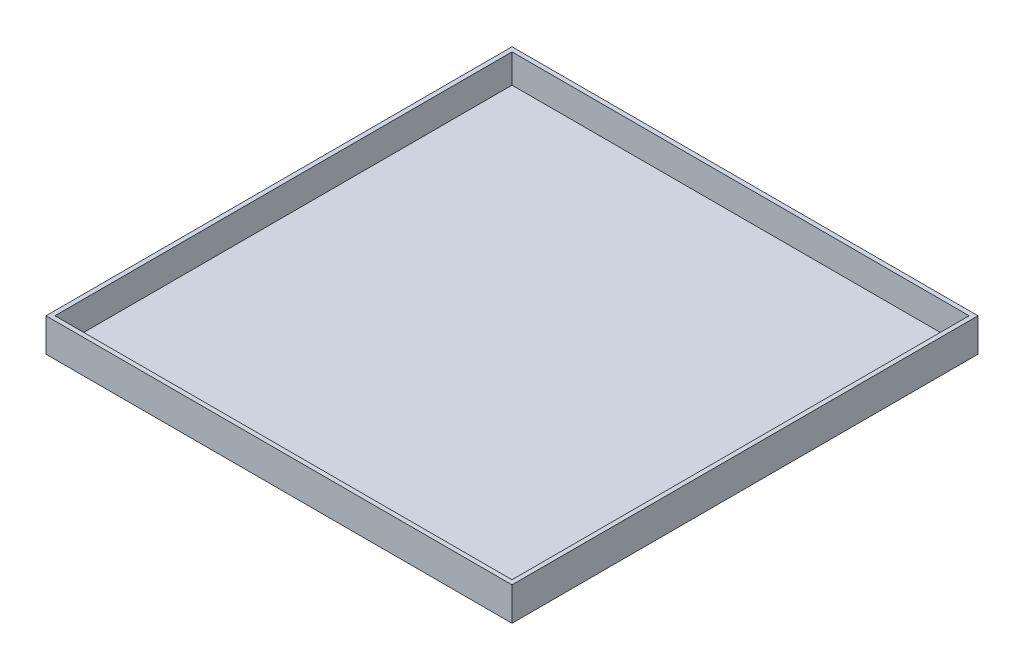
ISO-10303-21;
HEADER;
FILE_DESCRIPTION(('STEP AP214'),'2;1');
FILE_NAME('part.step','',(''),(''),'','','');
FILE_SCHEMA(('AUTOMOTIVE_DESIGN { 1 0 10303 214 1 1 1 1 }'));
ENDSEC;
DATA;
#1=APPLICATION_CONTEXT('core data for automotive mechanical design processes');
#2=APPLICATION_PROTOCOL_DEFINITION('international standard','automotive_design',2000,#1);
#3=PRODUCT_CONTEXT('',#1,'mechanical');
#4=PRODUCT('Part','Part','',(#3));
#5=PRODUCT_RELATED_PRODUCT_CATEGORY('part','',(#4));
#6=PRODUCT_DEFINITION_FORMATION('','',#4);
#7=PRODUCT_DEFINITION_CONTEXT('part definition',#1,'design');
#8=PRODUCT_DEFINITION('design','',#6,#7);
#9=PRODUCT_DEFINITION_SHAPE('','',#8);
#10=(LENGTH_UNIT() NAMED_UNIT(*) SI_UNIT(.MILLI.,.METRE.));
#11=(NAMED_UNIT(*) PLANE_ANGLE_UNIT() SI_UNIT($,.RADIAN.));
#12=(NAMED_UNIT(*) SI_UNIT($,.STERADIAN.) SOLID_ANGLE_UNIT());
#13=UNCERTAINTY_MEASURE_WITH_UNIT(LENGTH_MEASURE(1.E-05),#10,'distance_accuracy_value','');
#14=(GEOMETRIC_REPRESENTATION_CONTEXT(3) GLOBAL_UNCERTAINTY_ASSIGNED_CONTEXT((#13)) GLOBAL_UNIT_ASSIGNED_CONTEXT((#10,
#11,#12)) REPRESENTATION_CONTEXT('',''));
#15=CARTESIAN_POINT('',(0.,0.,0.));
#16=DIRECTION('',(0.,0.,1.));
#17=DIRECTION('',(1.,0.,0.));
#18=AXIS2_PLACEMENT_3D('',#15,#16,#17);
#19=CARTESIAN_POINT('',(0.,15.,0.));
#20=DIRECTION('',(0.,-1.,0.));
#21=DIRECTION('',(0.,0.,-1.));
#22=AXIS2_PLACEMENT_3D('',#19,#20,#21);
#23=PLANE('',#22);
#24=DIRECTION('',(0.,0.,1.));
#25=VECTOR('',#24,1.);
#26=CARTESIAN_POINT('',(0.,15.,0.));
#27=LINE('',#26,#25);
#28=CARTESIAN_POINT('',(0.,15.,-210.));
#29=VERTEX_POINT('',#28);
#30=CARTESIAN_POINT('',(0.,15.,0.));
#31=VERTEX_POINT('',#30);
#32=EDGE_CURVE('E168',#29,#31,#27,.T.);
#33=ORIENTED_EDGE('',*,*,#32,.T.);
#34=DIRECTION('',(1.,0.,0.));
#35=VECTOR('',#34,1.);
#36=CARTESIAN_POINT('',(0.,15.,0.));
#37=LINE('',#36,#35);
#38=CARTESIAN_POINT('',(210.,15.,0.));
#39=VERTEX_POINT('',#38);
#40=EDGE_CURVE('E100',#31,#39,#37,.T.);
#41=ORIENTED_EDGE('',*,*,#40,.T.);
#42=DIRECTION('',(0.,0.,-1.));
#43=VECTOR('',#42,1.);
#44=CARTESIAN_POINT('',(210.,15.,0.));
#45=LINE('',#44,#43);
#46=CARTESIAN_POINT('',(210.,15.,-210.));
#47=VERTEX_POINT('',#46);
#48=EDGE_CURVE('E172',#39,#47,#45,.T.);
#49=ORIENTED_EDGE('',*,*,#48,.T.);
#50=DIRECTION('',(-1.,0.,0.));
#51=VECTOR('',#50,1.);
#52=CARTESIAN_POINT('',(0.,15.,-210.));
#53=LINE('',#52,#51);
#54=EDGE_CURVE('E72',#47,#29,#53,.T.);
#55=ORIENTED_EDGE('',*,*,#54,.T.);
#56=EDGE_LOOP('',(#33,#41,#49,#55));
#57=FACE_BOUND('',#56,.T.);
#58=DIRECTION('',(0.,0.,1.));
#59=VECTOR('',#58,1.);
#60=CARTESIAN_POINT('',(2.,15.,0.));
#61=LINE('',#60,#59);
#62=CARTESIAN_POINT('',(1.99999999999997,15.,-208.));
#63=VERTEX_POINT('',#62);
#64=CARTESIAN_POINT('',(2.,15.,-2.));
#65=VERTEX_POINT('',#64);
#66=EDGE_CURVE('E152',#63,#65,#61,.T.);
#67=ORIENTED_EDGE('',*,*,#66,.F.);
#68=DIRECTION('',(-1.,0.,0.));
#69=VECTOR('',#68,1.);
#70=CARTESIAN_POINT('',(0.,15.,-208.));
#71=LINE('',#70,#69);
#72=CARTESIAN_POINT('',(208.,15.,-208.));
#73=VERTEX_POINT('',#72);
#74=EDGE_CURVE('E165',#73,#63,#71,.T.);
#75=ORIENTED_EDGE('',*,*,#74,.F.);
#76=DIRECTION('',(0.,0.,-1.));
#77=VECTOR('',#76,1.);
#78=CARTESIAN_POINT('',(208.,15.,0.));
#79=LINE('',#78,#77);
#80=CARTESIAN_POINT('',(208.,15.,-2.));
#81=VERTEX_POINT('',#80);
#82=EDGE_CURVE('E162',#81,#73,#79,.T.);
#83=ORIENTED_EDGE('',*,*,#82,.F.);
#84=DIRECTION('',(1.,0.,0.));
#85=VECTOR('',#84,1.);
#86=CARTESIAN_POINT('',(0.,15.,-2.));
#87=LINE('',#86,#85);
#88=EDGE_CURVE('E138',#65,#81,#87,.T.);
#89=ORIENTED_EDGE('',*,*,#88,.F.);
#90=EDGE_LOOP('',(#67,#75,#83,#89));
#91=FACE_BOUND('',#90,.T.);
#92=ADVANCED_FACE('F47',(#57,#91),#23,.F.);
#93=CARTESIAN_POINT('',(0.,15.,0.));
#94=DIRECTION('',(1.,0.,0.));
#95=DIRECTION('',(0.,0.,-1.));
#96=AXIS2_PLACEMENT_3D('',#93,#94,#95);
#97=PLANE('',#96);
#98=DIRECTION('',(0.,0.,1.));
#99=VECTOR('',#98,1.);
#100=CARTESIAN_POINT('',(0.,0.,0.));
#101=LINE('',#100,#99);
#102=CARTESIAN_POINT('',(0.,0.,-210.));
#103=VERTEX_POINT('',#102);
#104=CARTESIAN_POINT('',(0.,0.,0.));
#105=VERTEX_POINT('',#104);
#106=EDGE_CURVE('E178',#103,#105,#101,.T.);
#107=ORIENTED_EDGE('',*,*,#106,.T.);
#108=DIRECTION('',(0.,-1.,0.));
#109=VECTOR('',#108,1.);
#110=CARTESIAN_POINT('',(0.,15.,0.));
#111=LINE('',#110,#109);
#112=EDGE_CURVE('E11',#31,#105,#111,.T.);
#113=ORIENTED_EDGE('',*,*,#112,.F.);
#114=ORIENTED_EDGE('',*,*,#32,.F.);
#115=DIRECTION('',(0.,-1.,0.));
#116=VECTOR('',#115,1.);
#117=CARTESIAN_POINT('',(0.,15.,-210.));
#118=LINE('',#117,#116);
#119=EDGE_CURVE('E177',#29,#103,#118,.T.);
#120=ORIENTED_EDGE('',*,*,#119,.T.);
#121=EDGE_LOOP('',(#107,#113,#114,#120));
#122=FACE_BOUND('',#121,.T.);
#123=ADVANCED_FACE('F49',(#122),#97,.F.);
#124=CARTESIAN_POINT('',(0.,15.,0.));
#125=DIRECTION('',(0.,0.,-1.));
#126=DIRECTION('',(-1.,0.,0.));
#127=AXIS2_PLACEMENT_3D('',#124,#125,#126);
#128=PLANE('',#127);
#129=DIRECTION('',(1.,0.,0.));
#130=VECTOR('',#129,1.);
#131=CARTESIAN_POINT('',(0.,0.,0.));
#132=LINE('',#131,#130);
#133=CARTESIAN_POINT('',(210.,0.,0.));
#134=VERTEX_POINT('',#133);
#135=EDGE_CURVE('E182',#105,#134,#132,.T.);
#136=ORIENTED_EDGE('',*,*,#135,.T.);
#137=DIRECTION('',(0.,-1.,0.));
#138=VECTOR('',#137,1.);
#139=CARTESIAN_POINT('',(210.,15.,0.));
#140=LINE('',#139,#138);
#141=EDGE_CURVE('E56',#39,#134,#140,.T.);
#142=ORIENTED_EDGE('',*,*,#141,.F.);
#143=ORIENTED_EDGE('',*,*,#40,.F.);
#144=ORIENTED_EDGE('',*,*,#112,.T.);
#145=EDGE_LOOP('',(#136,#142,#143,#144));
#146=FACE_BOUND('',#145,.T.);
#147=ADVANCED_FACE('F216',(#146),#128,.F.);
#148=CARTESIAN_POINT('',(210.,15.,0.));
#149=DIRECTION('',(-1.,0.,0.));
#150=DIRECTION('',(0.,0.,1.));
#151=AXIS2_PLACEMENT_3D('',#148,#149,#150);
#152=PLANE('',#151);
#153=DIRECTION('',(0.,0.,-1.));
#154=VECTOR('',#153,1.);
#155=CARTESIAN_POINT('',(210.,0.,0.));
#156=LINE('',#155,#154);
#157=CARTESIAN_POINT('',(210.,0.,-210.));
#158=VERTEX_POINT('',#157);
#159=EDGE_CURVE('E185',#134,#158,#156,.T.);
#160=ORIENTED_EDGE('',*,*,#159,.T.);
#161=DIRECTION('',(0.,-1.,0.));
#162=VECTOR('',#161,1.);
#163=CARTESIAN_POINT('',(210.,15.,-210.));
#164=LINE('',#163,#162);
#165=EDGE_CURVE('E191',#47,#158,#164,.T.);
#166=ORIENTED_EDGE('',*,*,#165,.F.);
#167=ORIENTED_EDGE('',*,*,#48,.F.);
#168=ORIENTED_EDGE('',*,*,#141,.T.);
#169=EDGE_LOOP('',(#160,#166,#167,#168));
#170=FACE_BOUND('',#169,.T.);
#171=ADVANCED_FACE('F199',(#170),#152,.F.);
#172=CARTESIAN_POINT('',(0.,15.,-210.));
#173=DIRECTION('',(0.,0.,1.));
#174=DIRECTION('',(1.,0.,0.));
#175=AXIS2_PLACEMENT_3D('',#172,#173,#174);
#176=PLANE('',#175);
#177=DIRECTION('',(-1.,0.,0.));
#178=VECTOR('',#177,1.);
#179=CARTESIAN_POINT('',(0.,0.,-210.));
#180=LINE('',#179,#178);
#181=EDGE_CURVE('E93',#158,#103,#180,.T.);
#182=ORIENTED_EDGE('',*,*,#181,.T.);
#183=ORIENTED_EDGE('',*,*,#119,.F.);
#184=ORIENTED_EDGE('',*,*,#54,.F.);
#185=ORIENTED_EDGE('',*,*,#165,.T.);
#186=EDGE_LOOP('',(#182,#183,#184,#185));
#187=FACE_BOUND('',#186,.T.);
#188=ADVANCED_FACE('F207',(#187),#176,.F.);
#189=CARTESIAN_POINT('',(0.,0.,0.));
#190=DIRECTION('',(0.,-1.,0.));
#191=DIRECTION('',(0.,0.,-1.));
#192=AXIS2_PLACEMENT_3D('',#189,#190,#191);
#193=PLANE('',#192);
#194=ORIENTED_EDGE('',*,*,#106,.F.);
#195=ORIENTED_EDGE('',*,*,#181,.F.);
#196=ORIENTED_EDGE('',*,*,#159,.F.);
#197=ORIENTED_EDGE('',*,*,#135,.F.);
#198=EDGE_LOOP('',(#194,#195,#196,#197));
#199=FACE_BOUND('',#198,.T.);
#200=ADVANCED_FACE('F203',(#199),#193,.T.);
#201=CARTESIAN_POINT('',(2.,15.,0.));
#202=DIRECTION('',(1.,0.,0.));
#203=DIRECTION('',(0.,0.,-1.));
#204=AXIS2_PLACEMENT_3D('',#201,#202,#203);
#205=PLANE('',#204);
#206=DIRECTION('',(0.,0.,1.));
#207=VECTOR('',#206,1.);
#208=CARTESIAN_POINT('',(2.,2.,0.));
#209=LINE('',#208,#207);
#210=CARTESIAN_POINT('',(1.99999999999997,2.,-208.));
#211=VERTEX_POINT('',#210);
#212=CARTESIAN_POINT('',(2.,2.,-2.));
#213=VERTEX_POINT('',#212);
#214=EDGE_CURVE('E128',#211,#213,#209,.T.);
#215=ORIENTED_EDGE('',*,*,#214,.F.);
#216=DIRECTION('',(0.,-1.,0.));
#217=VECTOR('',#216,1.);
#218=CARTESIAN_POINT('',(1.99999999999997,15.,-208.));
#219=LINE('',#218,#217);
#220=EDGE_CURVE('E156',#63,#211,#219,.T.);
#221=ORIENTED_EDGE('',*,*,#220,.F.);
#222=ORIENTED_EDGE('',*,*,#66,.T.);
#223=DIRECTION('',(0.,-1.,0.));
#224=VECTOR('',#223,1.);
#225=CARTESIAN_POINT('',(2.,15.,-2.));
#226=LINE('',#225,#224);
#227=EDGE_CURVE('E142',#65,#213,#226,.T.);
#228=ORIENTED_EDGE('',*,*,#227,.T.);
#229=EDGE_LOOP('',(#215,#221,#222,#228));
#230=FACE_BOUND('',#229,.T.);
#231=ADVANCED_FACE('F214',(#230),#205,.T.);
#232=CARTESIAN_POINT('',(0.,15.,-2.));
#233=DIRECTION('',(0.,0.,-1.));
#234=DIRECTION('',(-1.,0.,0.));
#235=AXIS2_PLACEMENT_3D('',#232,#233,#234);
#236=PLANE('',#235);
#237=DIRECTION('',(1.,0.,0.));
#238=VECTOR('',#237,1.);
#239=CARTESIAN_POINT('',(0.,2.,-2.));
#240=LINE('',#239,#238);
#241=CARTESIAN_POINT('',(208.,2.,-2.));
#242=VERTEX_POINT('',#241);
#243=EDGE_CURVE('E122',#213,#242,#240,.T.);
#244=ORIENTED_EDGE('',*,*,#243,.F.);
#245=ORIENTED_EDGE('',*,*,#227,.F.);
#246=ORIENTED_EDGE('',*,*,#88,.T.);
#247=DIRECTION('',(0.,-1.,0.));
#248=VECTOR('',#247,1.);
#249=CARTESIAN_POINT('',(208.,15.,-2.));
#250=LINE('',#249,#248);
#251=EDGE_CURVE('E135',#81,#242,#250,.T.);
#252=ORIENTED_EDGE('',*,*,#251,.T.);
#253=EDGE_LOOP('',(#244,#245,#246,#252));
#254=FACE_BOUND('',#253,.T.);
#255=ADVANCED_FACE('F136',(#254),#236,.T.);
#256=CARTESIAN_POINT('',(208.,15.,0.));
#257=DIRECTION('',(-1.,0.,0.));
#258=DIRECTION('',(0.,0.,1.));
#259=AXIS2_PLACEMENT_3D('',#256,#257,#258);
#260=PLANE('',#259);
#261=DIRECTION('',(0.,0.,-1.));
#262=VECTOR('',#261,1.);
#263=CARTESIAN_POINT('',(208.,2.,0.));
#264=LINE('',#263,#262);
#265=CARTESIAN_POINT('',(208.,2.,-208.));
#266=VERTEX_POINT('',#265);
#267=EDGE_CURVE('E126',#242,#266,#264,.T.);
#268=ORIENTED_EDGE('',*,*,#267,.F.);
#269=ORIENTED_EDGE('',*,*,#251,.F.);
#270=ORIENTED_EDGE('',*,*,#82,.T.);
#271=DIRECTION('',(0.,-1.,0.));
#272=VECTOR('',#271,1.);
#273=CARTESIAN_POINT('',(208.,15.,-208.));
#274=LINE('',#273,#272);
#275=EDGE_CURVE('E63',#73,#266,#274,.T.);
#276=ORIENTED_EDGE('',*,*,#275,.T.);
#277=EDGE_LOOP('',(#268,#269,#270,#276));
#278=FACE_BOUND('',#277,.T.);
#279=ADVANCED_FACE('F144',(#278),#260,.T.);
#280=CARTESIAN_POINT('',(0.,15.,-208.));
#281=DIRECTION('',(0.,0.,1.));
#282=DIRECTION('',(1.,0.,0.));
#283=AXIS2_PLACEMENT_3D('',#280,#281,#282);
#284=PLANE('',#283);
#285=DIRECTION('',(-1.,0.,0.));
#286=VECTOR('',#285,1.);
#287=CARTESIAN_POINT('',(0.,2.,-208.));
#288=LINE('',#287,#286);
#289=EDGE_CURVE('E146',#266,#211,#288,.T.);
#290=ORIENTED_EDGE('',*,*,#289,.F.);
#291=ORIENTED_EDGE('',*,*,#275,.F.);
#292=ORIENTED_EDGE('',*,*,#74,.T.);
#293=ORIENTED_EDGE('',*,*,#220,.T.);
#294=EDGE_LOOP('',(#290,#291,#292,#293));
#295=FACE_BOUND('',#294,.T.);
#296=ADVANCED_FACE('F227',(#295),#284,.T.);
#297=CARTESIAN_POINT('',(0.,2.,0.));
#298=DIRECTION('',(0.,-1.,0.));
#299=DIRECTION('',(0.,0.,-1.));
#300=AXIS2_PLACEMENT_3D('',#297,#298,#299);
#301=PLANE('',#300);
#302=ORIENTED_EDGE('',*,*,#214,.T.);
#303=ORIENTED_EDGE('',*,*,#243,.T.);
#304=ORIENTED_EDGE('',*,*,#267,.T.);
#305=ORIENTED_EDGE('',*,*,#289,.T.);
#306=EDGE_LOOP('',(#302,#303,#304,#305));
#307=FACE_BOUND('',#306,.T.);
#308=ADVANCED_FACE('F124',(#307),#301,.F.);
#309=CLOSED_SHELL('',(#92,#123,#147,#171,#188,#200,#231,#255,#279,#296,#308));
#310=MANIFOLD_SOLID_BREP('B2',#309);
#311=ADVANCED_BREP_SHAPE_REPRESENTATION('',(#18,#310),#14);
#312=SHAPE_DEFINITION_REPRESENTATION(#9,#311);
ENDSEC;
END-ISO-10303-21;
